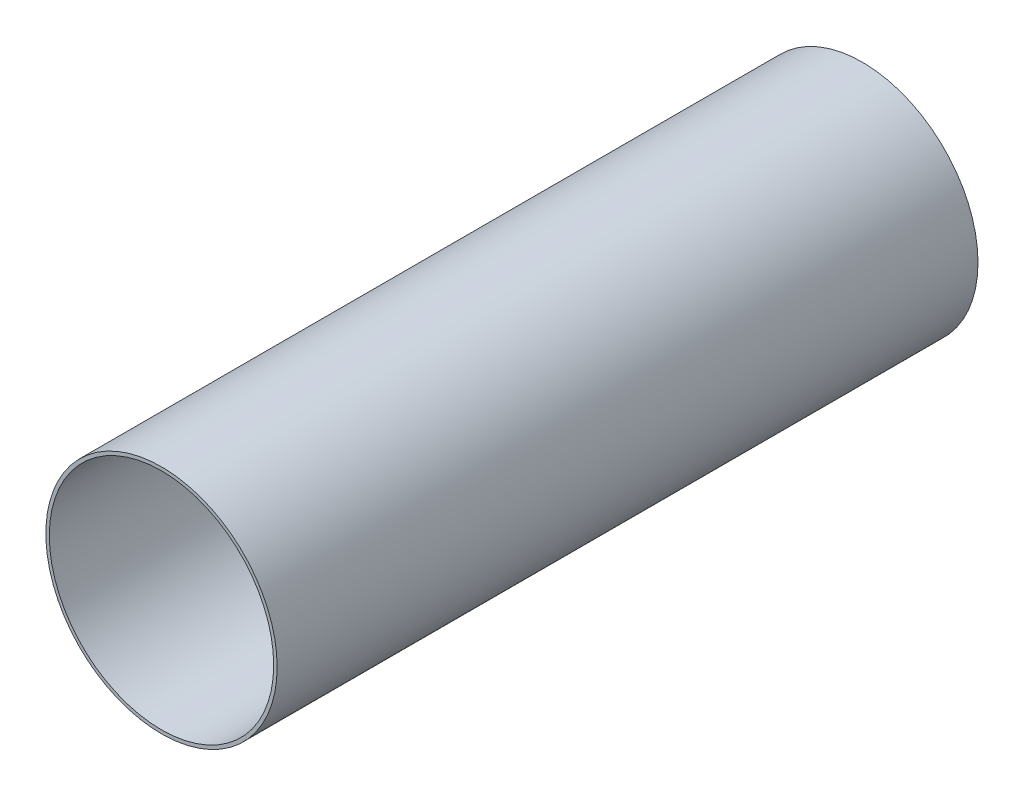
ISO-10303-21;
HEADER;
FILE_DESCRIPTION(('STEP AP214'),'2;1');
FILE_NAME('part.step','',(''),(''),'','','');
FILE_SCHEMA(('AUTOMOTIVE_DESIGN { 1 0 10303 214 1 1 1 1 }'));
ENDSEC;
DATA;
#1=APPLICATION_CONTEXT('core data for automotive mechanical design processes');
#2=APPLICATION_PROTOCOL_DEFINITION('international standard','automotive_design',2000,#1);
#3=PRODUCT_CONTEXT('',#1,'mechanical');
#4=PRODUCT('Part','Part','',(#3));
#5=PRODUCT_RELATED_PRODUCT_CATEGORY('part','',(#4));
#6=PRODUCT_DEFINITION_FORMATION('','',#4);
#7=PRODUCT_DEFINITION_CONTEXT('part definition',#1,'design');
#8=PRODUCT_DEFINITION('design','',#6,#7);
#9=PRODUCT_DEFINITION_SHAPE('','',#8);
#10=(LENGTH_UNIT() NAMED_UNIT(*) SI_UNIT(.MILLI.,.METRE.));
#11=(NAMED_UNIT(*) PLANE_ANGLE_UNIT() SI_UNIT($,.RADIAN.));
#12=(NAMED_UNIT(*) SI_UNIT($,.STERADIAN.) SOLID_ANGLE_UNIT());
#13=UNCERTAINTY_MEASURE_WITH_UNIT(LENGTH_MEASURE(1.E-05),#10,'distance_accuracy_value','');
#14=(GEOMETRIC_REPRESENTATION_CONTEXT(3) GLOBAL_UNCERTAINTY_ASSIGNED_CONTEXT((#13)) GLOBAL_UNIT_ASSIGNED_CONTEXT((#10,
#11,#12)) REPRESENTATION_CONTEXT('',''));
#15=CARTESIAN_POINT('',(0.,0.,0.));
#16=DIRECTION('',(0.,0.,1.));
#17=DIRECTION('',(1.,0.,0.));
#18=AXIS2_PLACEMENT_3D('',#15,#16,#17);
#19=CARTESIAN_POINT('',(0.,0.,303.));
#20=DIRECTION('',(0.,0.,1.));
#21=DIRECTION('',(1.,0.,0.));
#22=AXIS2_PLACEMENT_3D('',#19,#20,#21);
#23=PLANE('',#22);
#24=CARTESIAN_POINT('',(0.,0.,303.));
#25=DIRECTION('',(0.,0.,1.));
#26=DIRECTION('',(1.,0.,0.));
#27=AXIS2_PLACEMENT_3D('',#24,#25,#26);
#28=CIRCLE('',#27,50.);
#29=CARTESIAN_POINT('',(50.,0.,303.));
#30=VERTEX_POINT('',#29);
#31=EDGE_CURVE('E41',#30,#30,#28,.T.);
#32=ORIENTED_EDGE('',*,*,#31,.T.);
#33=EDGE_LOOP('',(#32));
#34=FACE_BOUND('',#33,.T.);
#35=CARTESIAN_POINT('',(0.,0.,303.));
#36=DIRECTION('',(0.,0.,1.));
#37=DIRECTION('',(1.,0.,0.));
#38=AXIS2_PLACEMENT_3D('',#35,#36,#37);
#39=CIRCLE('',#38,48.5);
#40=CARTESIAN_POINT('',(48.5,0.,303.));
#41=VERTEX_POINT('',#40);
#42=EDGE_CURVE('E50',#41,#41,#39,.T.);
#43=ORIENTED_EDGE('',*,*,#42,.F.);
#44=EDGE_LOOP('',(#43));
#45=FACE_BOUND('',#44,.T.);
#46=ADVANCED_FACE('F34',(#34,#45),#23,.T.);
#47=CARTESIAN_POINT('',(0.,0.,0.));
#48=DIRECTION('',(0.,0.,1.));
#49=DIRECTION('',(1.,0.,0.));
#50=AXIS2_PLACEMENT_3D('',#47,#48,#49);
#51=PLANE('',#50);
#52=CARTESIAN_POINT('',(0.,0.,0.));
#53=DIRECTION('',(0.,0.,1.));
#54=DIRECTION('',(1.,0.,0.));
#55=AXIS2_PLACEMENT_3D('',#52,#53,#54);
#56=CIRCLE('',#55,50.);
#57=CARTESIAN_POINT('',(50.,0.,0.));
#58=VERTEX_POINT('',#57);
#59=EDGE_CURVE('E45',#58,#58,#56,.T.);
#60=ORIENTED_EDGE('',*,*,#59,.F.);
#61=EDGE_LOOP('',(#60));
#62=FACE_BOUND('',#61,.T.);
#63=ADVANCED_FACE('F58',(#62),#51,.F.);
#64=CARTESIAN_POINT('',(0.,0.,303.));
#65=DIRECTION('',(0.,0.,-1.));
#66=DIRECTION('',(-1.,0.,0.));
#67=AXIS2_PLACEMENT_3D('',#64,#65,#66);
#68=CYLINDRICAL_SURFACE('',#67,50.);
#69=ORIENTED_EDGE('',*,*,#31,.F.);
#70=EDGE_LOOP('',(#69));
#71=FACE_BOUND('',#70,.T.);
#72=ORIENTED_EDGE('',*,*,#59,.T.);
#73=EDGE_LOOP('',(#72));
#74=FACE_BOUND('',#73,.T.);
#75=ADVANCED_FACE('F36',(#71,#74),#68,.T.);
#76=CARTESIAN_POINT('',(0.,0.,303.));
#77=DIRECTION('',(0.,0.,-1.));
#78=DIRECTION('',(-1.,0.,0.));
#79=AXIS2_PLACEMENT_3D('',#76,#77,#78);
#80=CYLINDRICAL_SURFACE('',#79,48.5);
#81=CARTESIAN_POINT('',(0.,0.,3.));
#82=DIRECTION('',(0.,0.,1.));
#83=DIRECTION('',(1.,0.,0.));
#84=AXIS2_PLACEMENT_3D('',#81,#82,#83);
#85=CIRCLE('',#84,48.5);
#86=CARTESIAN_POINT('',(48.5,0.,3.));
#87=VERTEX_POINT('',#86);
#88=EDGE_CURVE('E10',#87,#87,#85,.T.);
#89=ORIENTED_EDGE('',*,*,#88,.F.);
#90=EDGE_LOOP('',(#89));
#91=FACE_BOUND('',#90,.T.);
#92=ORIENTED_EDGE('',*,*,#42,.T.);
#93=EDGE_LOOP('',(#92));
#94=FACE_BOUND('',#93,.T.);
#95=ADVANCED_FACE('F55',(#91,#94),#80,.F.);
#96=CARTESIAN_POINT('',(0.,0.,3.));
#97=DIRECTION('',(0.,0.,1.));
#98=DIRECTION('',(1.,0.,0.));
#99=AXIS2_PLACEMENT_3D('',#96,#97,#98);
#100=PLANE('',#99);
#101=ORIENTED_EDGE('',*,*,#88,.T.);
#102=EDGE_LOOP('',(#101));
#103=FACE_BOUND('',#102,.T.);
#104=ADVANCED_FACE('F67',(#103),#100,.T.);
#105=CLOSED_SHELL('',(#46,#63,#75,#95,#104));
#106=MANIFOLD_SOLID_BREP('B2',#105);
#107=ADVANCED_BREP_SHAPE_REPRESENTATION('',(#18,#106),#14);
#108=SHAPE_DEFINITION_REPRESENTATION(#9,#107);
ENDSEC;
END-ISO-10303-21;
